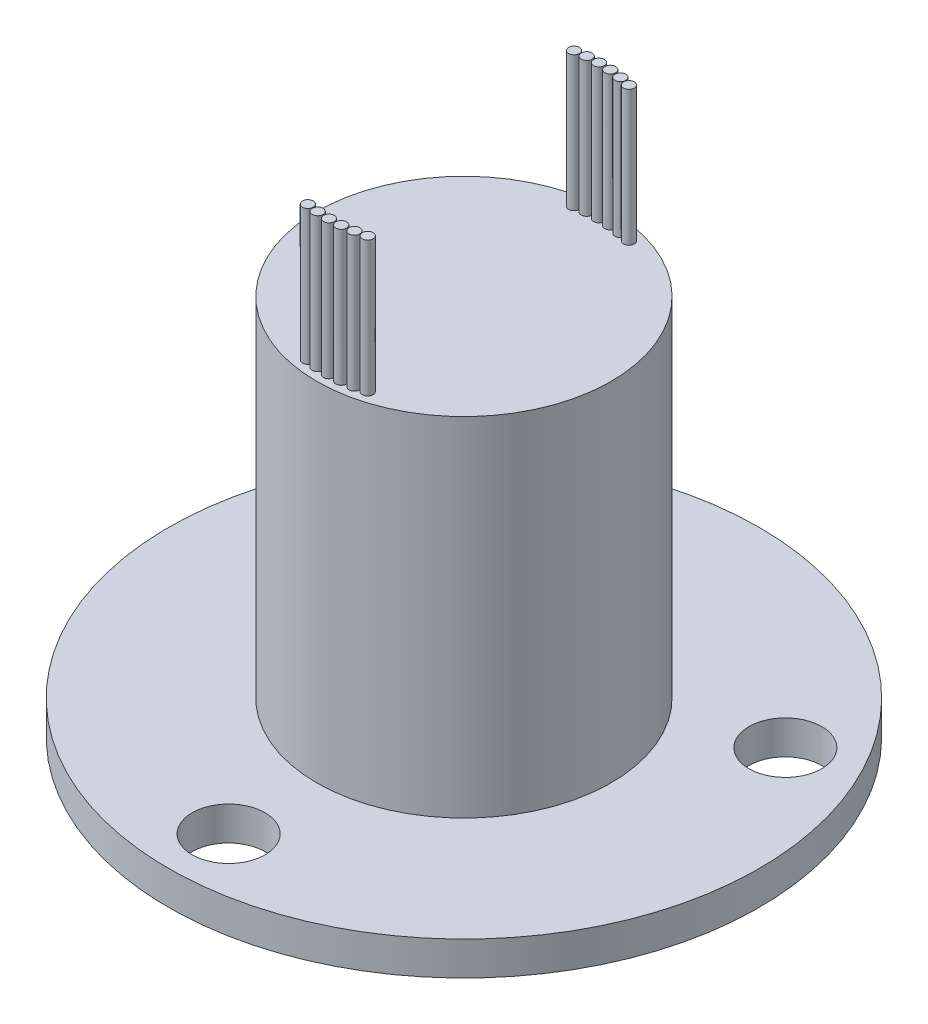
ISO-10303-21;
HEADER;
FILE_DESCRIPTION(('STEP AP214'),'2;1');
FILE_NAME('part.step','',(''),(''),'','','');
FILE_SCHEMA(('AUTOMOTIVE_DESIGN { 1 0 10303 214 1 1 1 1 }'));
ENDSEC;
DATA;
#1=APPLICATION_CONTEXT('core data for automotive mechanical design processes');
#2=APPLICATION_PROTOCOL_DEFINITION('international standard','automotive_design',2000,#1);
#3=PRODUCT_CONTEXT('',#1,'mechanical');
#4=PRODUCT('Part','Part','',(#3));
#5=PRODUCT_RELATED_PRODUCT_CATEGORY('part','',(#4));
#6=PRODUCT_DEFINITION_FORMATION('','',#4);
#7=PRODUCT_DEFINITION_CONTEXT('part definition',#1,'design');
#8=PRODUCT_DEFINITION('design','',#6,#7);
#9=PRODUCT_DEFINITION_SHAPE('','',#8);
#10=(LENGTH_UNIT() NAMED_UNIT(*) SI_UNIT(.MILLI.,.METRE.));
#11=(NAMED_UNIT(*) PLANE_ANGLE_UNIT() SI_UNIT($,.RADIAN.));
#12=(NAMED_UNIT(*) SI_UNIT($,.STERADIAN.) SOLID_ANGLE_UNIT());
#13=UNCERTAINTY_MEASURE_WITH_UNIT(LENGTH_MEASURE(1.E-05),#10,'distance_accuracy_value','');
#14=(GEOMETRIC_REPRESENTATION_CONTEXT(3) GLOBAL_UNCERTAINTY_ASSIGNED_CONTEXT((#13)) GLOBAL_UNIT_ASSIGNED_CONTEXT((#10,
#11,#12)) REPRESENTATION_CONTEXT('',''));
#15=CARTESIAN_POINT('',(0.,0.,0.));
#16=DIRECTION('',(0.,0.,1.));
#17=DIRECTION('',(1.,0.,0.));
#18=AXIS2_PLACEMENT_3D('',#15,#16,#17);
#19=CARTESIAN_POINT('',(0.,2.5,0.));
#20=DIRECTION('',(0.,-1.,0.));
#21=DIRECTION('',(0.,0.,-1.));
#22=AXIS2_PLACEMENT_3D('',#19,#20,#21);
#23=CYLINDRICAL_SURFACE('',#22,21.875);
#24=CARTESIAN_POINT('',(0.,2.5,0.));
#25=DIRECTION('',(0.,-1.,0.));
#26=DIRECTION('',(0.,0.,-1.));
#27=AXIS2_PLACEMENT_3D('',#24,#25,#26);
#28=CIRCLE('',#27,21.875);
#29=CARTESIAN_POINT('',(0.,2.5,-21.875));
#30=VERTEX_POINT('',#29);
#31=EDGE_CURVE('E79',#30,#30,#28,.T.);
#32=ORIENTED_EDGE('',*,*,#31,.T.);
#33=EDGE_LOOP('',(#32));
#34=FACE_BOUND('',#33,.T.);
#35=CARTESIAN_POINT('',(0.,0.,0.));
#36=DIRECTION('',(0.,-1.,0.));
#37=DIRECTION('',(0.,0.,-1.));
#38=AXIS2_PLACEMENT_3D('',#35,#36,#37);
#39=CIRCLE('',#38,21.875);
#40=CARTESIAN_POINT('',(0.,0.,-21.875));
#41=VERTEX_POINT('',#40);
#42=EDGE_CURVE('E82',#41,#41,#39,.T.);
#43=ORIENTED_EDGE('',*,*,#42,.F.);
#44=EDGE_LOOP('',(#43));
#45=FACE_BOUND('',#44,.T.);
#46=ADVANCED_FACE('F35',(#34,#45),#23,.T.);
#47=CARTESIAN_POINT('',(21.875,2.5,0.));
#48=DIRECTION('',(0.,1.,0.));
#49=DIRECTION('',(0.,0.,1.));
#50=AXIS2_PLACEMENT_3D('',#47,#48,#49);
#51=PLANE('',#50);
#52=CARTESIAN_POINT('',(0.,2.5,17.425));
#53=DIRECTION('',(0.,1.,0.));
#54=DIRECTION('',(0.,0.,1.));
#55=AXIS2_PLACEMENT_3D('',#52,#53,#54);
#56=CIRCLE('',#55,2.69999999999999);
#57=CARTESIAN_POINT('',(0.,2.5,20.125));
#58=VERTEX_POINT('',#57);
#59=EDGE_CURVE('E153',#58,#58,#56,.T.);
#60=ORIENTED_EDGE('',*,*,#59,.F.);
#61=EDGE_LOOP('',(#60));
#62=FACE_BOUND('',#61,.T.);
#63=CARTESIAN_POINT('',(-15.0904926609438,2.5,-8.71250000000007));
#64=DIRECTION('',(0.,1.,0.));
#65=DIRECTION('',(0.,0.,1.));
#66=AXIS2_PLACEMENT_3D('',#63,#64,#65);
#67=CIRCLE('',#66,2.69999999999999);
#68=CARTESIAN_POINT('',(-15.0904926609438,2.5,-6.01250000000008));
#69=VERTEX_POINT('',#68);
#70=EDGE_CURVE('E147',#69,#69,#67,.T.);
#71=ORIENTED_EDGE('',*,*,#70,.F.);
#72=EDGE_LOOP('',(#71));
#73=FACE_BOUND('',#72,.T.);
#74=CARTESIAN_POINT('',(15.0904926609438,2.5,-8.71250000000007));
#75=DIRECTION('',(0.,1.,0.));
#76=DIRECTION('',(0.,0.,1.));
#77=AXIS2_PLACEMENT_3D('',#74,#75,#76);
#78=CIRCLE('',#77,2.69999999999999);
#79=CARTESIAN_POINT('',(15.0904926609438,2.5,-6.01250000000008));
#80=VERTEX_POINT('',#79);
#81=EDGE_CURVE('E141',#80,#80,#78,.T.);
#82=ORIENTED_EDGE('',*,*,#81,.F.);
#83=EDGE_LOOP('',(#82));
#84=FACE_BOUND('',#83,.T.);
#85=CARTESIAN_POINT('',(0.,2.5,0.));
#86=DIRECTION('',(0.,1.,0.));
#87=DIRECTION('',(0.,0.,1.));
#88=AXIS2_PLACEMENT_3D('',#85,#86,#87);
#89=CIRCLE('',#88,10.9);
#90=CARTESIAN_POINT('',(0.,2.5,10.9));
#91=VERTEX_POINT('',#90);
#92=EDGE_CURVE('E78',#91,#91,#89,.T.);
#93=ORIENTED_EDGE('',*,*,#92,.F.);
#94=EDGE_LOOP('',(#93));
#95=FACE_BOUND('',#94,.T.);
#96=ORIENTED_EDGE('',*,*,#31,.F.);
#97=EDGE_LOOP('',(#96));
#98=FACE_BOUND('',#97,.T.);
#99=ADVANCED_FACE('F184',(#62,#73,#84,#95,#98),#51,.T.);
#100=CARTESIAN_POINT('',(0.,0.,0.));
#101=DIRECTION('',(0.,-1.,0.));
#102=DIRECTION('',(0.,0.,-1.));
#103=AXIS2_PLACEMENT_3D('',#100,#101,#102);
#104=PLANE('',#103);
#105=CARTESIAN_POINT('',(0.,0.,17.425));
#106=DIRECTION('',(0.,1.,0.));
#107=DIRECTION('',(0.,0.,1.));
#108=AXIS2_PLACEMENT_3D('',#105,#106,#107);
#109=CIRCLE('',#108,2.69999999999999);
#110=CARTESIAN_POINT('',(0.,0.,20.125));
#111=VERTEX_POINT('',#110);
#112=EDGE_CURVE('E150',#111,#111,#109,.T.);
#113=ORIENTED_EDGE('',*,*,#112,.T.);
#114=EDGE_LOOP('',(#113));
#115=FACE_BOUND('',#114,.T.);
#116=CARTESIAN_POINT('',(-15.0904926609438,0.,-8.71250000000007));
#117=DIRECTION('',(0.,1.,0.));
#118=DIRECTION('',(0.,0.,1.));
#119=AXIS2_PLACEMENT_3D('',#116,#117,#118);
#120=CIRCLE('',#119,2.69999999999999);
#121=CARTESIAN_POINT('',(-15.0904926609438,0.,-6.01250000000008));
#122=VERTEX_POINT('',#121);
#123=EDGE_CURVE('E144',#122,#122,#120,.T.);
#124=ORIENTED_EDGE('',*,*,#123,.T.);
#125=EDGE_LOOP('',(#124));
#126=FACE_BOUND('',#125,.T.);
#127=CARTESIAN_POINT('',(15.0904926609438,0.,-8.71250000000007));
#128=DIRECTION('',(0.,1.,0.));
#129=DIRECTION('',(0.,0.,1.));
#130=AXIS2_PLACEMENT_3D('',#127,#128,#129);
#131=CIRCLE('',#130,2.69999999999999);
#132=CARTESIAN_POINT('',(15.0904926609438,0.,-6.01250000000008));
#133=VERTEX_POINT('',#132);
#134=EDGE_CURVE('E138',#133,#133,#131,.T.);
#135=ORIENTED_EDGE('',*,*,#134,.T.);
#136=EDGE_LOOP('',(#135));
#137=FACE_BOUND('',#136,.T.);
#138=CARTESIAN_POINT('',(0.,0.,0.));
#139=DIRECTION('',(0.,-1.,0.));
#140=DIRECTION('',(0.,0.,-1.));
#141=AXIS2_PLACEMENT_3D('',#138,#139,#140);
#142=CIRCLE('',#141,9.59999999999999);
#143=CARTESIAN_POINT('',(0.,0.,-9.59999999999999));
#144=VERTEX_POINT('',#143);
#145=EDGE_CURVE('E93',#144,#144,#142,.T.);
#146=ORIENTED_EDGE('',*,*,#145,.F.);
#147=EDGE_LOOP('',(#146));
#148=FACE_BOUND('',#147,.T.);
#149=ORIENTED_EDGE('',*,*,#42,.T.);
#150=EDGE_LOOP('',(#149));
#151=FACE_BOUND('',#150,.T.);
#152=ADVANCED_FACE('F189',(#115,#126,#137,#148,#151),#104,.T.);
#153=CARTESIAN_POINT('',(0.,28.25,0.));
#154=DIRECTION('',(0.,-1.,0.));
#155=DIRECTION('',(0.,0.,-1.));
#156=AXIS2_PLACEMENT_3D('',#153,#154,#155);
#157=CYLINDRICAL_SURFACE('',#156,10.9);
#158=CARTESIAN_POINT('',(0.,28.25,0.));
#159=DIRECTION('',(0.,1.,0.));
#160=DIRECTION('',(0.,0.,1.));
#161=AXIS2_PLACEMENT_3D('',#158,#159,#160);
#162=CIRCLE('',#161,10.9);
#163=CARTESIAN_POINT('',(0.,28.25,10.9));
#164=VERTEX_POINT('',#163);
#165=EDGE_CURVE('E85',#164,#164,#162,.T.);
#166=ORIENTED_EDGE('',*,*,#165,.F.);
#167=EDGE_LOOP('',(#166));
#168=FACE_BOUND('',#167,.T.);
#169=ORIENTED_EDGE('',*,*,#92,.T.);
#170=EDGE_LOOP('',(#169));
#171=FACE_BOUND('',#170,.T.);
#172=ADVANCED_FACE('F196',(#168,#171),#157,.T.);
#173=CARTESIAN_POINT('',(0.,28.25,0.));
#174=DIRECTION('',(0.,1.,0.));
#175=DIRECTION('',(0.,0.,1.));
#176=AXIS2_PLACEMENT_3D('',#173,#174,#175);
#177=PLANE('',#176);
#178=CARTESIAN_POINT('',(2.54402640826538,28.25,9.67098390206748));
#179=DIRECTION('',(0.,1.,0.));
#180=DIRECTION('',(0.,0.,1.));
#181=AXIS2_PLACEMENT_3D('',#178,#179,#180);
#182=CIRCLE('',#181,0.399999999999999);
#183=CARTESIAN_POINT('',(2.54402640826538,28.25,10.0709839020675));
#184=VERTEX_POINT('',#183);
#185=EDGE_CURVE('E10',#184,#184,#182,.T.);
#186=ORIENTED_EDGE('',*,*,#185,.F.);
#187=EDGE_LOOP('',(#186));
#188=FACE_BOUND('',#187,.T.);
#189=CARTESIAN_POINT('',(0.,28.25,-10.));
#190=DIRECTION('',(0.,1.,0.));
#191=DIRECTION('',(0.,0.,1.));
#192=AXIS2_PLACEMENT_3D('',#189,#190,#191);
#193=CIRCLE('',#192,0.399999999999999);
#194=CARTESIAN_POINT('',(0.,28.25,-9.6));
#195=VERTEX_POINT('',#194);
#196=EDGE_CURVE('E41',#195,#195,#193,.T.);
#197=ORIENTED_EDGE('',*,*,#196,.F.);
#198=EDGE_LOOP('',(#197));
#199=FACE_BOUND('',#198,.T.);
#200=CARTESIAN_POINT('',(0.871557427476583,28.25,-9.96194698091746));
#201=DIRECTION('',(0.,1.,0.));
#202=DIRECTION('',(0.,0.,1.));
#203=AXIS2_PLACEMENT_3D('',#200,#201,#202);
#204=CIRCLE('',#203,0.399999999999999);
#205=CARTESIAN_POINT('',(0.871557427476583,28.25,-9.56194698091746));
#206=VERTEX_POINT('',#205);
#207=EDGE_CURVE('E45',#206,#206,#204,.T.);
#208=ORIENTED_EDGE('',*,*,#207,.F.);
#209=EDGE_LOOP('',(#208));
#210=FACE_BOUND('',#209,.T.);
#211=CARTESIAN_POINT('',(-0.871557427476583,28.25,-9.96194698091746));
#212=DIRECTION('',(0.,1.,0.));
#213=DIRECTION('',(0.,0.,1.));
#214=AXIS2_PLACEMENT_3D('',#211,#212,#213);
#215=CIRCLE('',#214,0.399999999999999);
#216=CARTESIAN_POINT('',(-0.871557427476583,28.25,-9.56194698091746));
#217=VERTEX_POINT('',#216);
#218=EDGE_CURVE('E49',#217,#217,#215,.T.);
#219=ORIENTED_EDGE('',*,*,#218,.F.);
#220=EDGE_LOOP('',(#219));
#221=FACE_BOUND('',#220,.T.);
#222=CARTESIAN_POINT('',(-1.70213758066599,28.25,-9.85407162834148));
#223=DIRECTION('',(0.,1.,0.));
#224=DIRECTION('',(0.,0.,1.));
#225=AXIS2_PLACEMENT_3D('',#222,#223,#224);
#226=CIRCLE('',#225,0.399999999999999);
#227=CARTESIAN_POINT('',(-1.70213758066599,28.25,-9.45407162834148));
#228=VERTEX_POINT('',#227);
#229=EDGE_CURVE('E54',#228,#228,#226,.T.);
#230=ORIENTED_EDGE('',*,*,#229,.F.);
#231=EDGE_LOOP('',(#230));
#232=FACE_BOUND('',#231,.T.);
#233=CARTESIAN_POINT('',(1.7380043241699,28.25,-9.8478089425601));
#234=DIRECTION('',(0.,1.,0.));
#235=DIRECTION('',(0.,0.,1.));
#236=AXIS2_PLACEMENT_3D('',#233,#234,#235);
#237=CIRCLE('',#236,0.400000000000001);
#238=CARTESIAN_POINT('',(1.7380043241699,28.25,-9.4478089425601));
#239=VERTEX_POINT('',#238);
#240=EDGE_CURVE('E57',#239,#239,#237,.T.);
#241=ORIENTED_EDGE('',*,*,#240,.F.);
#242=EDGE_LOOP('',(#241));
#243=FACE_BOUND('',#242,.T.);
#244=CARTESIAN_POINT('',(2.54402640826538,28.25,-9.67098390206748));
#245=DIRECTION('',(0.,1.,0.));
#246=DIRECTION('',(0.,0.,1.));
#247=AXIS2_PLACEMENT_3D('',#244,#245,#246);
#248=CIRCLE('',#247,0.399999999999999);
#249=CARTESIAN_POINT('',(2.54402640826538,28.25,-9.27098390206748));
#250=VERTEX_POINT('',#249);
#251=EDGE_CURVE('E60',#250,#250,#248,.T.);
#252=ORIENTED_EDGE('',*,*,#251,.F.);
#253=EDGE_LOOP('',(#252));
#254=FACE_BOUND('',#253,.T.);
#255=CARTESIAN_POINT('',(0.,28.25,10.));
#256=DIRECTION('',(0.,1.,0.));
#257=DIRECTION('',(0.,0.,1.));
#258=AXIS2_PLACEMENT_3D('',#255,#256,#257);
#259=CIRCLE('',#258,0.399999999999999);
#260=CARTESIAN_POINT('',(0.,28.25,10.4));
#261=VERTEX_POINT('',#260);
#262=EDGE_CURVE('E63',#261,#261,#259,.T.);
#263=ORIENTED_EDGE('',*,*,#262,.F.);
#264=EDGE_LOOP('',(#263));
#265=FACE_BOUND('',#264,.T.);
#266=CARTESIAN_POINT('',(0.871557427476583,28.25,9.96194698091746));
#267=DIRECTION('',(0.,1.,0.));
#268=DIRECTION('',(0.,0.,1.));
#269=AXIS2_PLACEMENT_3D('',#266,#267,#268);
#270=CIRCLE('',#269,0.399999999999999);
#271=CARTESIAN_POINT('',(0.871557427476583,28.25,10.3619469809175));
#272=VERTEX_POINT('',#271);
#273=EDGE_CURVE('E66',#272,#272,#270,.T.);
#274=ORIENTED_EDGE('',*,*,#273,.F.);
#275=EDGE_LOOP('',(#274));
#276=FACE_BOUND('',#275,.T.);
#277=CARTESIAN_POINT('',(-0.871557427476583,28.25,9.96194698091746));
#278=DIRECTION('',(0.,1.,0.));
#279=DIRECTION('',(0.,0.,1.));
#280=AXIS2_PLACEMENT_3D('',#277,#278,#279);
#281=CIRCLE('',#280,0.399999999999999);
#282=CARTESIAN_POINT('',(-0.871557427476583,28.25,10.3619469809175));
#283=VERTEX_POINT('',#282);
#284=EDGE_CURVE('E69',#283,#283,#281,.T.);
#285=ORIENTED_EDGE('',*,*,#284,.F.);
#286=EDGE_LOOP('',(#285));
#287=FACE_BOUND('',#286,.T.);
#288=CARTESIAN_POINT('',(-1.70213758066599,28.25,9.85407162834148));
#289=DIRECTION('',(0.,1.,0.));
#290=DIRECTION('',(0.,0.,1.));
#291=AXIS2_PLACEMENT_3D('',#288,#289,#290);
#292=CIRCLE('',#291,0.399999999999999);
#293=CARTESIAN_POINT('',(-1.70213758066599,28.25,10.2540716283415));
#294=VERTEX_POINT('',#293);
#295=EDGE_CURVE('E72',#294,#294,#292,.T.);
#296=ORIENTED_EDGE('',*,*,#295,.F.);
#297=EDGE_LOOP('',(#296));
#298=FACE_BOUND('',#297,.T.);
#299=CARTESIAN_POINT('',(1.7380043241699,28.25,9.8478089425601));
#300=DIRECTION('',(0.,1.,0.));
#301=DIRECTION('',(0.,0.,1.));
#302=AXIS2_PLACEMENT_3D('',#299,#300,#301);
#303=CIRCLE('',#302,0.400000000000001);
#304=CARTESIAN_POINT('',(1.7380043241699,28.25,10.2478089425601));
#305=VERTEX_POINT('',#304);
#306=EDGE_CURVE('E75',#305,#305,#303,.T.);
#307=ORIENTED_EDGE('',*,*,#306,.F.);
#308=EDGE_LOOP('',(#307));
#309=FACE_BOUND('',#308,.T.);
#310=ORIENTED_EDGE('',*,*,#165,.T.);
#311=EDGE_LOOP('',(#310));
#312=FACE_BOUND('',#311,.T.);
#313=ADVANCED_FACE('F202',(#188,#199,#210,#221,#232,#243,#254,#265,#276,#287,#298,#309,#312),
#177,.T.);
#314=CARTESIAN_POINT('',(0.,1.59999999999998,0.));
#315=DIRECTION('',(0.,1.,0.));
#316=DIRECTION('',(0.,0.,1.));
#317=AXIS2_PLACEMENT_3D('',#314,#315,#316);
#318=PLANE('',#317);
#319=CARTESIAN_POINT('',(0.,1.6,0.));
#320=DIRECTION('',(0.,-1.,0.));
#321=DIRECTION('',(0.,0.,-1.));
#322=AXIS2_PLACEMENT_3D('',#319,#320,#321);
#323=CIRCLE('',#322,8.1);
#324=CARTESIAN_POINT('',(0.,1.6,-8.1));
#325=VERTEX_POINT('',#324);
#326=EDGE_CURVE('E96',#325,#325,#323,.T.);
#327=ORIENTED_EDGE('',*,*,#326,.F.);
#328=EDGE_LOOP('',(#327));
#329=FACE_BOUND('',#328,.T.);
#330=CARTESIAN_POINT('',(0.,1.6,0.));
#331=DIRECTION('',(0.,-1.,0.));
#332=DIRECTION('',(0.,0.,-1.));
#333=AXIS2_PLACEMENT_3D('',#330,#331,#332);
#334=CIRCLE('',#333,9.59999999999999);
#335=CARTESIAN_POINT('',(0.,1.6,-9.59999999999999));
#336=VERTEX_POINT('',#335);
#337=EDGE_CURVE('E90',#336,#336,#334,.T.);
#338=ORIENTED_EDGE('',*,*,#337,.T.);
#339=EDGE_LOOP('',(#338));
#340=FACE_BOUND('',#339,.T.);
#341=ADVANCED_FACE('F180',(#329,#340),#318,.F.);
#342=CARTESIAN_POINT('',(0.,0.,0.));
#343=DIRECTION('',(0.,-1.,0.));
#344=DIRECTION('',(0.,0.,-1.));
#345=AXIS2_PLACEMENT_3D('',#342,#343,#344);
#346=CYLINDRICAL_SURFACE('',#345,9.59999999999999);
#347=ORIENTED_EDGE('',*,*,#337,.F.);
#348=EDGE_LOOP('',(#347));
#349=FACE_BOUND('',#348,.T.);
#350=ORIENTED_EDGE('',*,*,#145,.T.);
#351=EDGE_LOOP('',(#350));
#352=FACE_BOUND('',#351,.T.);
#353=ADVANCED_FACE('F174',(#349,#352),#346,.F.);
#354=CARTESIAN_POINT('',(0.,1.6,0.));
#355=DIRECTION('',(0.,-1.,0.));
#356=DIRECTION('',(0.,0.,-1.));
#357=AXIS2_PLACEMENT_3D('',#354,#355,#356);
#358=CYLINDRICAL_SURFACE('',#357,8.1);
#359=ORIENTED_EDGE('',*,*,#326,.T.);
#360=EDGE_LOOP('',(#359));
#361=FACE_BOUND('',#360,.T.);
#362=CARTESIAN_POINT('',(0.,0.,0.));
#363=DIRECTION('',(0.,-1.,0.));
#364=DIRECTION('',(0.,0.,-1.));
#365=AXIS2_PLACEMENT_3D('',#362,#363,#364);
#366=CIRCLE('',#365,8.1);
#367=CARTESIAN_POINT('',(0.,0.,-8.1));
#368=VERTEX_POINT('',#367);
#369=EDGE_CURVE('E99',#368,#368,#366,.T.);
#370=ORIENTED_EDGE('',*,*,#369,.F.);
#371=EDGE_LOOP('',(#370));
#372=FACE_BOUND('',#371,.T.);
#373=ADVANCED_FACE('F169',(#361,#372),#358,.T.);
#374=CARTESIAN_POINT('',(0.,0.,0.));
#375=DIRECTION('',(0.,-1.,0.));
#376=DIRECTION('',(0.,0.,-1.));
#377=AXIS2_PLACEMENT_3D('',#374,#375,#376);
#378=PLANE('',#377);
#379=CARTESIAN_POINT('',(0.,0.,0.));
#380=DIRECTION('',(0.,-1.,0.));
#381=DIRECTION('',(0.,0.,-1.));
#382=AXIS2_PLACEMENT_3D('',#379,#380,#381);
#383=CIRCLE('',#382,4.74999999999999);
#384=CARTESIAN_POINT('',(0.,0.,-4.74999999999999));
#385=VERTEX_POINT('',#384);
#386=EDGE_CURVE('E159',#385,#385,#383,.T.);
#387=ORIENTED_EDGE('',*,*,#386,.F.);
#388=EDGE_LOOP('',(#387));
#389=FACE_BOUND('',#388,.T.);
#390=ORIENTED_EDGE('',*,*,#369,.T.);
#391=EDGE_LOOP('',(#390));
#392=FACE_BOUND('',#391,.T.);
#393=ADVANCED_FACE('F165',(#389,#392),#378,.T.);
#394=CARTESIAN_POINT('',(1.7380043241699,38.25,9.8478089425601));
#395=DIRECTION('',(0.,-1.,0.));
#396=DIRECTION('',(0.,0.,-1.));
#397=AXIS2_PLACEMENT_3D('',#394,#395,#396);
#398=CYLINDRICAL_SURFACE('',#397,0.400000000000001);
#399=CARTESIAN_POINT('',(1.7380043241699,38.25,9.8478089425601));
#400=DIRECTION('',(0.,-1.,0.));
#401=DIRECTION('',(0.,0.,-1.));
#402=AXIS2_PLACEMENT_3D('',#399,#400,#401);
#403=CIRCLE('',#402,0.400000000000001);
#404=CARTESIAN_POINT('',(1.7380043241699,38.25,9.4478089425601));
#405=VERTEX_POINT('',#404);
#406=EDGE_CURVE('E102',#405,#405,#403,.T.);
#407=ORIENTED_EDGE('',*,*,#406,.T.);
#408=EDGE_LOOP('',(#407));
#409=FACE_BOUND('',#408,.T.);
#410=ORIENTED_EDGE('',*,*,#306,.T.);
#411=EDGE_LOOP('',(#410));
#412=FACE_BOUND('',#411,.T.);
#413=ADVANCED_FACE('F168',(#409,#412),#398,.T.);
#414=CARTESIAN_POINT('',(2.1380043241699,38.25,9.8478089425601));
#415=DIRECTION('',(0.,1.,0.));
#416=DIRECTION('',(0.,0.,1.));
#417=AXIS2_PLACEMENT_3D('',#414,#415,#416);
#418=PLANE('',#417);
#419=ORIENTED_EDGE('',*,*,#406,.F.);
#420=EDGE_LOOP('',(#419));
#421=FACE_BOUND('',#420,.T.);
#422=ADVANCED_FACE('F399',(#421),#418,.T.);
#423=CARTESIAN_POINT('',(-1.70213758066599,38.25,9.85407162834148));
#424=DIRECTION('',(0.,-1.,0.));
#425=DIRECTION('',(0.,0.,-1.));
#426=AXIS2_PLACEMENT_3D('',#423,#424,#425);
#427=CYLINDRICAL_SURFACE('',#426,0.399999999999999);
#428=CARTESIAN_POINT('',(-1.70213758066599,38.25,9.85407162834148));
#429=DIRECTION('',(0.,-1.,0.));
#430=DIRECTION('',(0.,0.,-1.));
#431=AXIS2_PLACEMENT_3D('',#428,#429,#430);
#432=CIRCLE('',#431,0.399999999999999);
#433=CARTESIAN_POINT('',(-1.70213758066599,38.25,9.45407162834148));
#434=VERTEX_POINT('',#433);
#435=EDGE_CURVE('E105',#434,#434,#432,.T.);
#436=ORIENTED_EDGE('',*,*,#435,.T.);
#437=EDGE_LOOP('',(#436));
#438=FACE_BOUND('',#437,.T.);
#439=ORIENTED_EDGE('',*,*,#295,.T.);
#440=EDGE_LOOP('',(#439));
#441=FACE_BOUND('',#440,.T.);
#442=ADVANCED_FACE('F395',(#438,#441),#427,.T.);
#443=CARTESIAN_POINT('',(-1.30213758066599,38.25,9.85407162834148));
#444=DIRECTION('',(0.,1.,0.));
#445=DIRECTION('',(0.,0.,1.));
#446=AXIS2_PLACEMENT_3D('',#443,#444,#445);
#447=PLANE('',#446);
#448=ORIENTED_EDGE('',*,*,#435,.F.);
#449=EDGE_LOOP('',(#448));
#450=FACE_BOUND('',#449,.T.);
#451=ADVANCED_FACE('F391',(#450),#447,.T.);
#452=CARTESIAN_POINT('',(-0.871557427476583,38.25,9.96194698091746));
#453=DIRECTION('',(0.,-1.,0.));
#454=DIRECTION('',(0.,0.,-1.));
#455=AXIS2_PLACEMENT_3D('',#452,#453,#454);
#456=CYLINDRICAL_SURFACE('',#455,0.399999999999999);
#457=CARTESIAN_POINT('',(-0.871557427476583,38.25,9.96194698091746));
#458=DIRECTION('',(0.,-1.,0.));
#459=DIRECTION('',(0.,0.,-1.));
#460=AXIS2_PLACEMENT_3D('',#457,#458,#459);
#461=CIRCLE('',#460,0.399999999999999);
#462=CARTESIAN_POINT('',(-0.871557427476583,38.25,9.56194698091746));
#463=VERTEX_POINT('',#462);
#464=EDGE_CURVE('E108',#463,#463,#461,.T.);
#465=ORIENTED_EDGE('',*,*,#464,.T.);
#466=EDGE_LOOP('',(#465));
#467=FACE_BOUND('',#466,.T.);
#468=ORIENTED_EDGE('',*,*,#284,.T.);
#469=EDGE_LOOP('',(#468));
#470=FACE_BOUND('',#469,.T.);
#471=ADVANCED_FACE('F387',(#467,#470),#456,.T.);
#472=CARTESIAN_POINT('',(-0.471557427476584,38.25,9.96194698091746));
#473=DIRECTION('',(0.,1.,0.));
#474=DIRECTION('',(0.,0.,1.));
#475=AXIS2_PLACEMENT_3D('',#472,#473,#474);
#476=PLANE('',#475);
#477=ORIENTED_EDGE('',*,*,#464,.F.);
#478=EDGE_LOOP('',(#477));
#479=FACE_BOUND('',#478,.T.);
#480=ADVANCED_FACE('F383',(#479),#476,.T.);
#481=CARTESIAN_POINT('',(0.871557427476583,38.25,9.96194698091746));
#482=DIRECTION('',(0.,-1.,0.));
#483=DIRECTION('',(0.,0.,-1.));
#484=AXIS2_PLACEMENT_3D('',#481,#482,#483);
#485=CYLINDRICAL_SURFACE('',#484,0.399999999999999);
#486=CARTESIAN_POINT('',(0.871557427476583,38.25,9.96194698091746));
#487=DIRECTION('',(0.,-1.,0.));
#488=DIRECTION('',(0.,0.,-1.));
#489=AXIS2_PLACEMENT_3D('',#486,#487,#488);
#490=CIRCLE('',#489,0.399999999999999);
#491=CARTESIAN_POINT('',(0.871557427476583,38.25,9.56194698091746));
#492=VERTEX_POINT('',#491);
#493=EDGE_CURVE('E111',#492,#492,#490,.T.);
#494=ORIENTED_EDGE('',*,*,#493,.T.);
#495=EDGE_LOOP('',(#494));
#496=FACE_BOUND('',#495,.T.);
#497=ORIENTED_EDGE('',*,*,#273,.T.);
#498=EDGE_LOOP('',(#497));
#499=FACE_BOUND('',#498,.T.);
#500=ADVANCED_FACE('F379',(#496,#499),#485,.T.);
#501=CARTESIAN_POINT('',(1.27155742747658,38.25,9.96194698091746));
#502=DIRECTION('',(0.,1.,0.));
#503=DIRECTION('',(0.,0.,1.));
#504=AXIS2_PLACEMENT_3D('',#501,#502,#503);
#505=PLANE('',#504);
#506=ORIENTED_EDGE('',*,*,#493,.F.);
#507=EDGE_LOOP('',(#506));
#508=FACE_BOUND('',#507,.T.);
#509=ADVANCED_FACE('F375',(#508),#505,.T.);
#510=CARTESIAN_POINT('',(0.,38.25,10.));
#511=DIRECTION('',(0.,-1.,0.));
#512=DIRECTION('',(0.,0.,-1.));
#513=AXIS2_PLACEMENT_3D('',#510,#511,#512);
#514=CYLINDRICAL_SURFACE('',#513,0.399999999999999);
#515=CARTESIAN_POINT('',(0.,38.25,10.));
#516=DIRECTION('',(0.,-1.,0.));
#517=DIRECTION('',(0.,0.,-1.));
#518=AXIS2_PLACEMENT_3D('',#515,#516,#517);
#519=CIRCLE('',#518,0.399999999999999);
#520=CARTESIAN_POINT('',(0.,38.25,9.6));
#521=VERTEX_POINT('',#520);
#522=EDGE_CURVE('E114',#521,#521,#519,.T.);
#523=ORIENTED_EDGE('',*,*,#522,.T.);
#524=EDGE_LOOP('',(#523));
#525=FACE_BOUND('',#524,.T.);
#526=ORIENTED_EDGE('',*,*,#262,.T.);
#527=EDGE_LOOP('',(#526));
#528=FACE_BOUND('',#527,.T.);
#529=ADVANCED_FACE('F371',(#525,#528),#514,.T.);
#530=CARTESIAN_POINT('',(0.399999999999999,38.25,10.));
#531=DIRECTION('',(0.,1.,0.));
#532=DIRECTION('',(0.,0.,1.));
#533=AXIS2_PLACEMENT_3D('',#530,#531,#532);
#534=PLANE('',#533);
#535=ORIENTED_EDGE('',*,*,#522,.F.);
#536=EDGE_LOOP('',(#535));
#537=FACE_BOUND('',#536,.T.);
#538=ADVANCED_FACE('F367',(#537),#534,.T.);
#539=CARTESIAN_POINT('',(2.54402640826538,38.25,-9.67098390206748));
#540=DIRECTION('',(0.,-1.,0.));
#541=DIRECTION('',(0.,0.,-1.));
#542=AXIS2_PLACEMENT_3D('',#539,#540,#541);
#543=CYLINDRICAL_SURFACE('',#542,0.399999999999999);
#544=CARTESIAN_POINT('',(2.54402640826538,38.25,-9.67098390206748));
#545=DIRECTION('',(0.,-1.,0.));
#546=DIRECTION('',(0.,0.,-1.));
#547=AXIS2_PLACEMENT_3D('',#544,#545,#546);
#548=CIRCLE('',#547,0.399999999999999);
#549=CARTESIAN_POINT('',(2.54402640826538,38.25,-10.0709839020675));
#550=VERTEX_POINT('',#549);
#551=EDGE_CURVE('E117',#550,#550,#548,.T.);
#552=ORIENTED_EDGE('',*,*,#551,.T.);
#553=EDGE_LOOP('',(#552));
#554=FACE_BOUND('',#553,.T.);
#555=ORIENTED_EDGE('',*,*,#251,.T.);
#556=EDGE_LOOP('',(#555));
#557=FACE_BOUND('',#556,.T.);
#558=ADVANCED_FACE('F363',(#554,#557),#543,.T.);
#559=CARTESIAN_POINT('',(2.94402640826538,38.25,-9.67098390206748));
#560=DIRECTION('',(0.,1.,0.));
#561=DIRECTION('',(0.,0.,1.));
#562=AXIS2_PLACEMENT_3D('',#559,#560,#561);
#563=PLANE('',#562);
#564=ORIENTED_EDGE('',*,*,#551,.F.);
#565=EDGE_LOOP('',(#564));
#566=FACE_BOUND('',#565,.T.);
#567=ADVANCED_FACE('F359',(#566),#563,.T.);
#568=CARTESIAN_POINT('',(1.7380043241699,38.25,-9.8478089425601));
#569=DIRECTION('',(0.,-1.,0.));
#570=DIRECTION('',(0.,0.,-1.));
#571=AXIS2_PLACEMENT_3D('',#568,#569,#570);
#572=CYLINDRICAL_SURFACE('',#571,0.400000000000001);
#573=CARTESIAN_POINT('',(1.7380043241699,38.25,-9.8478089425601));
#574=DIRECTION('',(0.,-1.,0.));
#575=DIRECTION('',(0.,0.,-1.));
#576=AXIS2_PLACEMENT_3D('',#573,#574,#575);
#577=CIRCLE('',#576,0.400000000000001);
#578=CARTESIAN_POINT('',(1.7380043241699,38.25,-10.2478089425601));
#579=VERTEX_POINT('',#578);
#580=EDGE_CURVE('E120',#579,#579,#577,.T.);
#581=ORIENTED_EDGE('',*,*,#580,.T.);
#582=EDGE_LOOP('',(#581));
#583=FACE_BOUND('',#582,.T.);
#584=ORIENTED_EDGE('',*,*,#240,.T.);
#585=EDGE_LOOP('',(#584));
#586=FACE_BOUND('',#585,.T.);
#587=ADVANCED_FACE('F355',(#583,#586),#572,.T.);
#588=CARTESIAN_POINT('',(2.1380043241699,38.25,-9.8478089425601));
#589=DIRECTION('',(0.,1.,0.));
#590=DIRECTION('',(0.,0.,1.));
#591=AXIS2_PLACEMENT_3D('',#588,#589,#590);
#592=PLANE('',#591);
#593=ORIENTED_EDGE('',*,*,#580,.F.);
#594=EDGE_LOOP('',(#593));
#595=FACE_BOUND('',#594,.T.);
#596=ADVANCED_FACE('F351',(#595),#592,.T.);
#597=CARTESIAN_POINT('',(-1.70213758066599,38.25,-9.85407162834148));
#598=DIRECTION('',(0.,-1.,0.));
#599=DIRECTION('',(0.,0.,-1.));
#600=AXIS2_PLACEMENT_3D('',#597,#598,#599);
#601=CYLINDRICAL_SURFACE('',#600,0.399999999999999);
#602=CARTESIAN_POINT('',(-1.70213758066599,38.25,-9.85407162834148));
#603=DIRECTION('',(0.,-1.,0.));
#604=DIRECTION('',(0.,0.,-1.));
#605=AXIS2_PLACEMENT_3D('',#602,#603,#604);
#606=CIRCLE('',#605,0.399999999999999);
#607=CARTESIAN_POINT('',(-1.70213758066599,38.25,-10.2540716283415));
#608=VERTEX_POINT('',#607);
#609=EDGE_CURVE('E123',#608,#608,#606,.T.);
#610=ORIENTED_EDGE('',*,*,#609,.T.);
#611=EDGE_LOOP('',(#610));
#612=FACE_BOUND('',#611,.T.);
#613=ORIENTED_EDGE('',*,*,#229,.T.);
#614=EDGE_LOOP('',(#613));
#615=FACE_BOUND('',#614,.T.);
#616=ADVANCED_FACE('F347',(#612,#615),#601,.T.);
#617=CARTESIAN_POINT('',(-1.30213758066599,38.25,-9.85407162834148));
#618=DIRECTION('',(0.,1.,0.));
#619=DIRECTION('',(0.,0.,1.));
#620=AXIS2_PLACEMENT_3D('',#617,#618,#619);
#621=PLANE('',#620);
#622=ORIENTED_EDGE('',*,*,#609,.F.);
#623=EDGE_LOOP('',(#622));
#624=FACE_BOUND('',#623,.T.);
#625=ADVANCED_FACE('F343',(#624),#621,.T.);
#626=CARTESIAN_POINT('',(-0.871557427476583,38.25,-9.96194698091746));
#627=DIRECTION('',(0.,-1.,0.));
#628=DIRECTION('',(0.,0.,-1.));
#629=AXIS2_PLACEMENT_3D('',#626,#627,#628);
#630=CYLINDRICAL_SURFACE('',#629,0.399999999999999);
#631=CARTESIAN_POINT('',(-0.871557427476583,38.25,-9.96194698091746));
#632=DIRECTION('',(0.,-1.,0.));
#633=DIRECTION('',(0.,0.,-1.));
#634=AXIS2_PLACEMENT_3D('',#631,#632,#633);
#635=CIRCLE('',#634,0.399999999999999);
#636=CARTESIAN_POINT('',(-0.871557427476583,38.25,-10.3619469809175));
#637=VERTEX_POINT('',#636);
#638=EDGE_CURVE('E126',#637,#637,#635,.T.);
#639=ORIENTED_EDGE('',*,*,#638,.T.);
#640=EDGE_LOOP('',(#639));
#641=FACE_BOUND('',#640,.T.);
#642=ORIENTED_EDGE('',*,*,#218,.T.);
#643=EDGE_LOOP('',(#642));
#644=FACE_BOUND('',#643,.T.);
#645=ADVANCED_FACE('F339',(#641,#644),#630,.T.);
#646=CARTESIAN_POINT('',(-0.471557427476584,38.25,-9.96194698091746));
#647=DIRECTION('',(0.,1.,0.));
#648=DIRECTION('',(0.,0.,1.));
#649=AXIS2_PLACEMENT_3D('',#646,#647,#648);
#650=PLANE('',#649);
#651=ORIENTED_EDGE('',*,*,#638,.F.);
#652=EDGE_LOOP('',(#651));
#653=FACE_BOUND('',#652,.T.);
#654=ADVANCED_FACE('F335',(#653),#650,.T.);
#655=CARTESIAN_POINT('',(0.871557427476583,38.25,-9.96194698091746));
#656=DIRECTION('',(0.,-1.,0.));
#657=DIRECTION('',(0.,0.,-1.));
#658=AXIS2_PLACEMENT_3D('',#655,#656,#657);
#659=CYLINDRICAL_SURFACE('',#658,0.399999999999999);
#660=CARTESIAN_POINT('',(0.871557427476583,38.25,-9.96194698091746));
#661=DIRECTION('',(0.,-1.,0.));
#662=DIRECTION('',(0.,0.,-1.));
#663=AXIS2_PLACEMENT_3D('',#660,#661,#662);
#664=CIRCLE('',#663,0.399999999999999);
#665=CARTESIAN_POINT('',(0.871557427476583,38.25,-10.3619469809175));
#666=VERTEX_POINT('',#665);
#667=EDGE_CURVE('E129',#666,#666,#664,.T.);
#668=ORIENTED_EDGE('',*,*,#667,.T.);
#669=EDGE_LOOP('',(#668));
#670=FACE_BOUND('',#669,.T.);
#671=ORIENTED_EDGE('',*,*,#207,.T.);
#672=EDGE_LOOP('',(#671));
#673=FACE_BOUND('',#672,.T.);
#674=ADVANCED_FACE('F331',(#670,#673),#659,.T.);
#675=CARTESIAN_POINT('',(1.27155742747658,38.25,-9.96194698091746));
#676=DIRECTION('',(0.,1.,0.));
#677=DIRECTION('',(0.,0.,1.));
#678=AXIS2_PLACEMENT_3D('',#675,#676,#677);
#679=PLANE('',#678);
#680=ORIENTED_EDGE('',*,*,#667,.F.);
#681=EDGE_LOOP('',(#680));
#682=FACE_BOUND('',#681,.T.);
#683=ADVANCED_FACE('F327',(#682),#679,.T.);
#684=CARTESIAN_POINT('',(0.,38.25,-10.));
#685=DIRECTION('',(0.,-1.,0.));
#686=DIRECTION('',(0.,0.,-1.));
#687=AXIS2_PLACEMENT_3D('',#684,#685,#686);
#688=CYLINDRICAL_SURFACE('',#687,0.399999999999999);
#689=CARTESIAN_POINT('',(0.,38.25,-10.));
#690=DIRECTION('',(0.,-1.,0.));
#691=DIRECTION('',(0.,0.,-1.));
#692=AXIS2_PLACEMENT_3D('',#689,#690,#691);
#693=CIRCLE('',#692,0.399999999999999);
#694=CARTESIAN_POINT('',(0.,38.25,-10.4));
#695=VERTEX_POINT('',#694);
#696=EDGE_CURVE('E132',#695,#695,#693,.T.);
#697=ORIENTED_EDGE('',*,*,#696,.T.);
#698=EDGE_LOOP('',(#697));
#699=FACE_BOUND('',#698,.T.);
#700=ORIENTED_EDGE('',*,*,#196,.T.);
#701=EDGE_LOOP('',(#700));
#702=FACE_BOUND('',#701,.T.);
#703=ADVANCED_FACE('F323',(#699,#702),#688,.T.);
#704=CARTESIAN_POINT('',(0.399999999999999,38.25,-10.));
#705=DIRECTION('',(0.,1.,0.));
#706=DIRECTION('',(0.,0.,1.));
#707=AXIS2_PLACEMENT_3D('',#704,#705,#706);
#708=PLANE('',#707);
#709=ORIENTED_EDGE('',*,*,#696,.F.);
#710=EDGE_LOOP('',(#709));
#711=FACE_BOUND('',#710,.T.);
#712=ADVANCED_FACE('F319',(#711),#708,.T.);
#713=CARTESIAN_POINT('',(2.54402640826538,38.25,9.67098390206748));
#714=DIRECTION('',(0.,-1.,0.));
#715=DIRECTION('',(0.,0.,-1.));
#716=AXIS2_PLACEMENT_3D('',#713,#714,#715);
#717=CYLINDRICAL_SURFACE('',#716,0.399999999999999);
#718=CARTESIAN_POINT('',(2.54402640826538,38.25,9.67098390206748));
#719=DIRECTION('',(0.,-1.,0.));
#720=DIRECTION('',(0.,0.,-1.));
#721=AXIS2_PLACEMENT_3D('',#718,#719,#720);
#722=CIRCLE('',#721,0.399999999999999);
#723=CARTESIAN_POINT('',(2.54402640826538,38.25,9.27098390206748));
#724=VERTEX_POINT('',#723);
#725=EDGE_CURVE('E135',#724,#724,#722,.T.);
#726=ORIENTED_EDGE('',*,*,#725,.T.);
#727=EDGE_LOOP('',(#726));
#728=FACE_BOUND('',#727,.T.);
#729=ORIENTED_EDGE('',*,*,#185,.T.);
#730=EDGE_LOOP('',(#729));
#731=FACE_BOUND('',#730,.T.);
#732=ADVANCED_FACE('F315',(#728,#731),#717,.T.);
#733=CARTESIAN_POINT('',(2.94402640826538,38.25,9.67098390206748));
#734=DIRECTION('',(0.,1.,0.));
#735=DIRECTION('',(0.,0.,1.));
#736=AXIS2_PLACEMENT_3D('',#733,#734,#735);
#737=PLANE('',#736);
#738=ORIENTED_EDGE('',*,*,#725,.F.);
#739=EDGE_LOOP('',(#738));
#740=FACE_BOUND('',#739,.T.);
#741=ADVANCED_FACE('F259',(#740),#737,.T.);
#742=CARTESIAN_POINT('',(15.0904926609438,2.5,-8.71250000000007));
#743=DIRECTION('',(0.,1.,0.));
#744=DIRECTION('',(0.,0.,1.));
#745=AXIS2_PLACEMENT_3D('',#742,#743,#744);
#746=CYLINDRICAL_SURFACE('',#745,2.69999999999999);
#747=ORIENTED_EDGE('',*,*,#134,.F.);
#748=EDGE_LOOP('',(#747));
#749=FACE_BOUND('',#748,.T.);
#750=ORIENTED_EDGE('',*,*,#81,.T.);
#751=EDGE_LOOP('',(#750));
#752=FACE_BOUND('',#751,.T.);
#753=ADVANCED_FACE('F253',(#749,#752),#746,.F.);
#754=CARTESIAN_POINT('',(-15.0904926609438,2.5,-8.71250000000007));
#755=DIRECTION('',(0.,1.,0.));
#756=DIRECTION('',(0.,0.,1.));
#757=AXIS2_PLACEMENT_3D('',#754,#755,#756);
#758=CYLINDRICAL_SURFACE('',#757,2.69999999999999);
#759=ORIENTED_EDGE('',*,*,#123,.F.);
#760=EDGE_LOOP('',(#759));
#761=FACE_BOUND('',#760,.T.);
#762=ORIENTED_EDGE('',*,*,#70,.T.);
#763=EDGE_LOOP('',(#762));
#764=FACE_BOUND('',#763,.T.);
#765=ADVANCED_FACE('F258',(#761,#764),#758,.F.);
#766=CARTESIAN_POINT('',(0.,2.5,17.425));
#767=DIRECTION('',(0.,1.,0.));
#768=DIRECTION('',(0.,0.,1.));
#769=AXIS2_PLACEMENT_3D('',#766,#767,#768);
#770=CYLINDRICAL_SURFACE('',#769,2.69999999999999);
#771=ORIENTED_EDGE('',*,*,#112,.F.);
#772=EDGE_LOOP('',(#771));
#773=FACE_BOUND('',#772,.T.);
#774=ORIENTED_EDGE('',*,*,#59,.T.);
#775=EDGE_LOOP('',(#774));
#776=FACE_BOUND('',#775,.T.);
#777=ADVANCED_FACE('F271',(#773,#776),#770,.F.);
#778=CARTESIAN_POINT('',(0.,0.499999999999992,0.));
#779=DIRECTION('',(0.,1.,0.));
#780=DIRECTION('',(0.,0.,1.));
#781=AXIS2_PLACEMENT_3D('',#778,#779,#780);
#782=PLANE('',#781);
#783=CARTESIAN_POINT('',(0.,0.5,0.));
#784=DIRECTION('',(0.,-1.,0.));
#785=DIRECTION('',(0.,0.,-1.));
#786=AXIS2_PLACEMENT_3D('',#783,#784,#785);
#787=CIRCLE('',#786,4.74999999999999);
#788=CARTESIAN_POINT('',(0.,0.5,-4.74999999999999));
#789=VERTEX_POINT('',#788);
#790=EDGE_CURVE('E156',#789,#789,#787,.T.);
#791=ORIENTED_EDGE('',*,*,#790,.T.);
#792=EDGE_LOOP('',(#791));
#793=FACE_BOUND('',#792,.T.);
#794=ADVANCED_FACE('F281',(#793),#782,.F.);
#795=CARTESIAN_POINT('',(0.,0.,0.));
#796=DIRECTION('',(0.,-1.,0.));
#797=DIRECTION('',(0.,0.,-1.));
#798=AXIS2_PLACEMENT_3D('',#795,#796,#797);
#799=CYLINDRICAL_SURFACE('',#798,4.74999999999999);
#800=ORIENTED_EDGE('',*,*,#790,.F.);
#801=EDGE_LOOP('',(#800));
#802=FACE_BOUND('',#801,.T.);
#803=ORIENTED_EDGE('',*,*,#386,.T.);
#804=EDGE_LOOP('',(#803));
#805=FACE_BOUND('',#804,.T.);
#806=ADVANCED_FACE('F163',(#802,#805),#799,.F.);
#807=CLOSED_SHELL('',(#46,#99,#152,#172,#313,#341,#353,#373,#393,#413,#422,#442,#451,#471,#480,
#500,#509,#529,#538,#558,#567,#587,#596,#616,#625,#645,#654,#674,#683,#703,#712,#732,#741,#753,
#765,#777,#794,#806));
#808=MANIFOLD_SOLID_BREP('B2',#807);
#809=ADVANCED_BREP_SHAPE_REPRESENTATION('',(#18,#808),#14);
#810=SHAPE_DEFINITION_REPRESENTATION(#9,#809);
ENDSEC;
END-ISO-10303-21;
